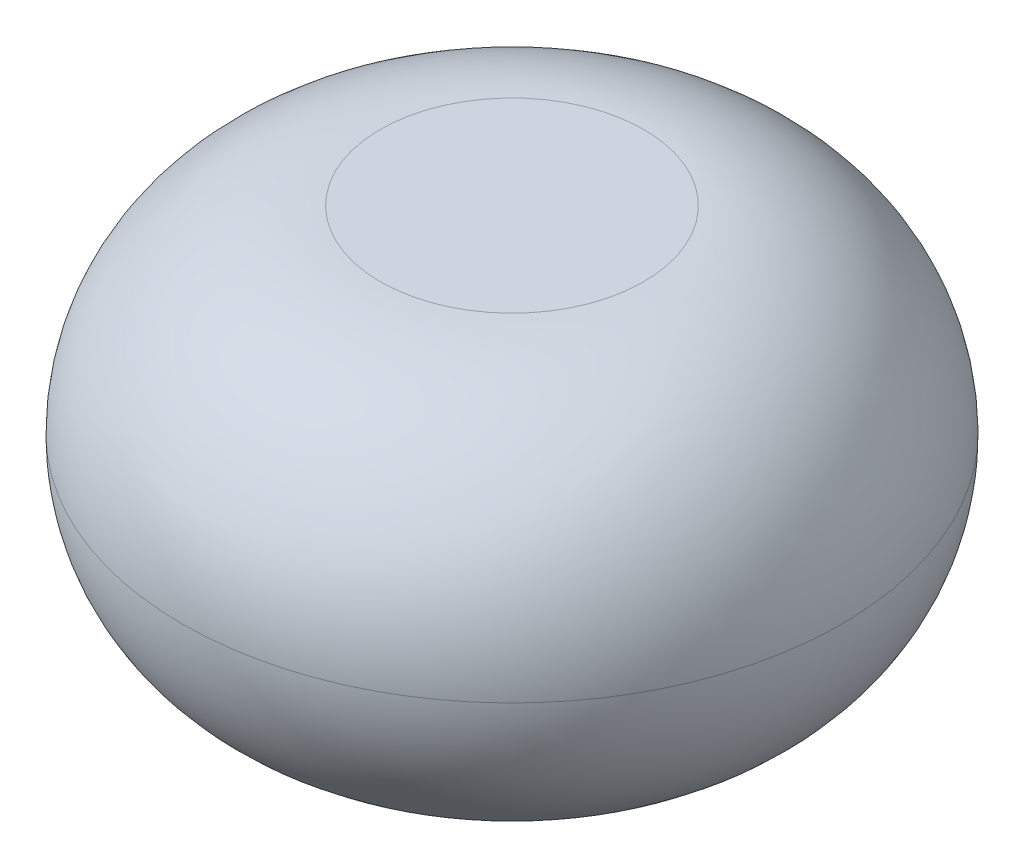
ISO-10303-21;
HEADER;
FILE_DESCRIPTION(('STEP AP214'),'2;1');
FILE_NAME('part.step','',(''),(''),'','','');
FILE_SCHEMA(('AUTOMOTIVE_DESIGN { 1 0 10303 214 1 1 1 1 }'));
ENDSEC;
DATA;
#1=APPLICATION_CONTEXT('core data for automotive mechanical design processes');
#2=APPLICATION_PROTOCOL_DEFINITION('international standard','automotive_design',2000,#1);
#3=PRODUCT_CONTEXT('',#1,'mechanical');
#4=PRODUCT('Part','Part','',(#3));
#5=PRODUCT_RELATED_PRODUCT_CATEGORY('part','',(#4));
#6=PRODUCT_DEFINITION_FORMATION('','',#4);
#7=PRODUCT_DEFINITION_CONTEXT('part definition',#1,'design');
#8=PRODUCT_DEFINITION('design','',#6,#7);
#9=PRODUCT_DEFINITION_SHAPE('','',#8);
#10=(LENGTH_UNIT() NAMED_UNIT(*) SI_UNIT(.MILLI.,.METRE.));
#11=(NAMED_UNIT(*) PLANE_ANGLE_UNIT() SI_UNIT($,.RADIAN.));
#12=(NAMED_UNIT(*) SI_UNIT($,.STERADIAN.) SOLID_ANGLE_UNIT());
#13=UNCERTAINTY_MEASURE_WITH_UNIT(LENGTH_MEASURE(1.E-05),#10,'distance_accuracy_value','');
#14=(GEOMETRIC_REPRESENTATION_CONTEXT(3) GLOBAL_UNCERTAINTY_ASSIGNED_CONTEXT((#13)) GLOBAL_UNIT_ASSIGNED_CONTEXT((#10,
#11,#12)) REPRESENTATION_CONTEXT('',''));
#15=CARTESIAN_POINT('',(0.,0.,0.));
#16=DIRECTION('',(0.,0.,1.));
#17=DIRECTION('',(1.,0.,0.));
#18=AXIS2_PLACEMENT_3D('',#15,#16,#17);
#19=CARTESIAN_POINT('',(0.,150.,0.));
#20=DIRECTION('',(0.,1.,0.));
#21=DIRECTION('',(0.,0.,1.));
#22=AXIS2_PLACEMENT_3D('',#19,#20,#21);
#23=PLANE('',#22);
#24=CARTESIAN_POINT('',(0.,150.,0.));
#25=DIRECTION('',(0.,1.,0.));
#26=DIRECTION('',(0.,0.,1.));
#27=AXIS2_PLACEMENT_3D('',#24,#25,#26);
#28=CIRCLE('',#27,50.);
#29=CARTESIAN_POINT('',(0.,150.,50.));
#30=VERTEX_POINT('',#29);
#31=EDGE_CURVE('E10',#30,#30,#28,.T.);
#32=ORIENTED_EDGE('',*,*,#31,.T.);
#33=EDGE_LOOP('',(#32));
#34=FACE_BOUND('',#33,.T.);
#35=ADVANCED_FACE('F39',(#34),#23,.T.);
#36=CARTESIAN_POINT('',(0.,0.,0.));
#37=DIRECTION('',(0.,1.,0.));
#38=DIRECTION('',(0.,0.,1.));
#39=AXIS2_PLACEMENT_3D('',#36,#37,#38);
#40=PLANE('',#39);
#41=CARTESIAN_POINT('',(0.,0.,0.));
#42=DIRECTION('',(0.,1.,0.));
#43=DIRECTION('',(0.,0.,1.));
#44=AXIS2_PLACEMENT_3D('',#41,#42,#43);
#45=CIRCLE('',#44,50.);
#46=CARTESIAN_POINT('',(0.,0.,50.));
#47=VERTEX_POINT('',#46);
#48=EDGE_CURVE('E47',#47,#47,#45,.F.);
#49=ORIENTED_EDGE('',*,*,#48,.T.);
#50=EDGE_LOOP('',(#49));
#51=FACE_BOUND('',#50,.T.);
#52=ADVANCED_FACE('F60',(#51),#40,.F.);
#53=CARTESIAN_POINT('',(0.,75.,0.));
#54=DIRECTION('',(0.,1.,0.));
#55=DIRECTION('',(0.,0.,1.));
#56=AXIS2_PLACEMENT_3D('',#53,#54,#55);
#57=DEGENERATE_TOROIDAL_SURFACE('',#56,50.,75.,.T.);
#58=ORIENTED_EDGE('',*,*,#31,.F.);
#59=EDGE_LOOP('',(#58));
#60=FACE_BOUND('',#59,.T.);
#61=CARTESIAN_POINT('',(0.,75.,0.));
#62=DIRECTION('',(0.,1.,0.));
#63=DIRECTION('',(0.,0.,1.));
#64=AXIS2_PLACEMENT_3D('',#61,#62,#63);
#65=CIRCLE('',#64,125.);
#66=CARTESIAN_POINT('',(0.,75.,125.));
#67=VERTEX_POINT('',#66);
#68=EDGE_CURVE('E43',#67,#67,#65,.F.);
#69=ORIENTED_EDGE('',*,*,#68,.F.);
#70=EDGE_LOOP('',(#69));
#71=FACE_BOUND('',#70,.T.);
#72=ADVANCED_FACE('F41',(#60,#71),#57,.T.);
#73=CARTESIAN_POINT('',(0.,75.,0.));
#74=DIRECTION('',(0.,1.,0.));
#75=DIRECTION('',(0.,0.,1.));
#76=AXIS2_PLACEMENT_3D('',#73,#74,#75);
#77=DEGENERATE_TOROIDAL_SURFACE('',#76,50.,75.,.T.);
#78=ORIENTED_EDGE('',*,*,#48,.F.);
#79=EDGE_LOOP('',(#78));
#80=FACE_BOUND('',#79,.T.);
#81=ORIENTED_EDGE('',*,*,#68,.T.);
#82=EDGE_LOOP('',(#81));
#83=FACE_BOUND('',#82,.T.);
#84=ADVANCED_FACE('F57',(#80,#83),#77,.T.);
#85=CLOSED_SHELL('',(#35,#52,#72,#84));
#86=MANIFOLD_SOLID_BREP('B2',#85);
#87=ADVANCED_BREP_SHAPE_REPRESENTATION('',(#18,#86),#14);
#88=SHAPE_DEFINITION_REPRESENTATION(#9,#87);
ENDSEC;
END-ISO-10303-21;
